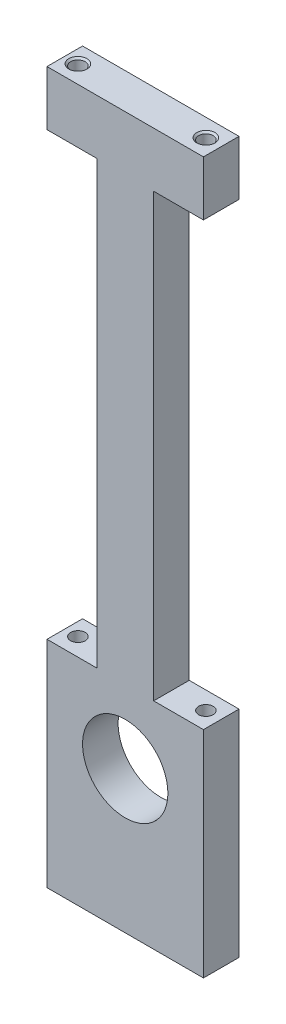
ISO-10303-21;
HEADER;
FILE_DESCRIPTION(('STEP AP214'),'2;1');
FILE_NAME('part.step','',(''),(''),'','','');
FILE_SCHEMA(('AUTOMOTIVE_DESIGN { 1 0 10303 214 1 1 1 1 }'));
ENDSEC;
DATA;
#1=APPLICATION_CONTEXT('core data for automotive mechanical design processes');
#2=APPLICATION_PROTOCOL_DEFINITION('international standard','automotive_design',2000,#1);
#3=PRODUCT_CONTEXT('',#1,'mechanical');
#4=PRODUCT('Part','Part','',(#3));
#5=PRODUCT_RELATED_PRODUCT_CATEGORY('part','',(#4));
#6=PRODUCT_DEFINITION_FORMATION('','',#4);
#7=PRODUCT_DEFINITION_CONTEXT('part definition',#1,'design');
#8=PRODUCT_DEFINITION('design','',#6,#7);
#9=PRODUCT_DEFINITION_SHAPE('','',#8);
#10=(LENGTH_UNIT() NAMED_UNIT(*) SI_UNIT(.MILLI.,.METRE.));
#11=(NAMED_UNIT(*) PLANE_ANGLE_UNIT() SI_UNIT($,.RADIAN.));
#12=(NAMED_UNIT(*) SI_UNIT($,.STERADIAN.) SOLID_ANGLE_UNIT());
#13=UNCERTAINTY_MEASURE_WITH_UNIT(LENGTH_MEASURE(1.E-05),#10,'distance_accuracy_value','');
#14=(GEOMETRIC_REPRESENTATION_CONTEXT(3) GLOBAL_UNCERTAINTY_ASSIGNED_CONTEXT((#13)) GLOBAL_UNIT_ASSIGNED_CONTEXT((#10,
#11,#12)) REPRESENTATION_CONTEXT('',''));
#15=CARTESIAN_POINT('',(0.,0.,0.));
#16=DIRECTION('',(0.,0.,1.));
#17=DIRECTION('',(1.,0.,0.));
#18=AXIS2_PLACEMENT_3D('',#15,#16,#17);
#19=CARTESIAN_POINT('',(-11.,10.2507068870375,5.));
#20=DIRECTION('',(0.,-1.,0.));
#21=DIRECTION('',(0.,0.,-1.));
#22=AXIS2_PLACEMENT_3D('',#19,#20,#21);
#23=PLANE('',#22);
#24=CARTESIAN_POINT('',(-9.15471218437872,10.2507068870375,2.5));
#25=DIRECTION('',(0.,-1.,0.));
#26=DIRECTION('',(0.,0.,-1.));
#27=AXIS2_PLACEMENT_3D('',#24,#25,#26);
#28=CIRCLE('',#27,1.02499999999998);
#29=CARTESIAN_POINT('',(-9.15471218437872,10.2507068870375,1.47500000000002));
#30=VERTEX_POINT('',#29);
#31=EDGE_CURVE('E167',#30,#30,#28,.T.);
#32=ORIENTED_EDGE('',*,*,#31,.T.);
#33=EDGE_LOOP('',(#32));
#34=FACE_BOUND('',#33,.T.);
#35=DIRECTION('',(0.,0.,1.));
#36=VECTOR('',#35,1.);
#37=CARTESIAN_POINT('',(-4.00000000000001,10.2507068870375,-73.136611144884));
#38=LINE('',#37,#36);
#39=CARTESIAN_POINT('',(-4.00000000000001,10.2507068870375,0.));
#40=VERTEX_POINT('',#39);
#41=CARTESIAN_POINT('',(-4.00000000000001,10.2507068870375,5.));
#42=VERTEX_POINT('',#41);
#43=EDGE_CURVE('E60',#40,#42,#38,.T.);
#44=ORIENTED_EDGE('',*,*,#43,.F.);
#45=DIRECTION('',(-1.,0.,0.));
#46=VECTOR('',#45,1.);
#47=CARTESIAN_POINT('',(-11.,10.2507068870375,0.));
#48=LINE('',#47,#46);
#49=CARTESIAN_POINT('',(-11.,10.2507068870375,0.));
#50=VERTEX_POINT('',#49);
#51=EDGE_CURVE('E248',#40,#50,#48,.T.);
#52=ORIENTED_EDGE('',*,*,#51,.T.);
#53=DIRECTION('',(0.,0.,-1.));
#54=VECTOR('',#53,1.);
#55=CARTESIAN_POINT('',(-11.,10.2507068870375,5.));
#56=LINE('',#55,#54);
#57=CARTESIAN_POINT('',(-11.,10.2507068870375,5.));
#58=VERTEX_POINT('',#57);
#59=EDGE_CURVE('E45',#58,#50,#56,.T.);
#60=ORIENTED_EDGE('',*,*,#59,.F.);
#61=DIRECTION('',(-1.,0.,0.));
#62=VECTOR('',#61,1.);
#63=CARTESIAN_POINT('',(-11.,10.2507068870375,5.));
#64=LINE('',#63,#62);
#65=EDGE_CURVE('E134',#42,#58,#64,.T.);
#66=ORIENTED_EDGE('',*,*,#65,.F.);
#67=EDGE_LOOP('',(#44,#52,#60,#66));
#68=FACE_BOUND('',#67,.T.);
#69=ADVANCED_FACE('F37',(#34,#68),#23,.F.);
#70=CARTESIAN_POINT('',(0.,0.,5.));
#71=DIRECTION('',(0.,0.,-1.));
#72=DIRECTION('',(-1.,0.,0.));
#73=AXIS2_PLACEMENT_3D('',#70,#71,#72);
#74=CYLINDRICAL_SURFACE('',#73,6.);
#75=CARTESIAN_POINT('',(0.,0.,0.));
#76=DIRECTION('',(0.,0.,-1.));
#77=DIRECTION('',(1.,0.,0.));
#78=AXIS2_PLACEMENT_3D('',#75,#76,#77);
#79=CIRCLE('',#78,6.);
#80=CARTESIAN_POINT('',(6.,0.,0.));
#81=VERTEX_POINT('',#80);
#82=EDGE_CURVE('E205',#81,#81,#79,.T.);
#83=ORIENTED_EDGE('',*,*,#82,.T.);
#84=EDGE_LOOP('',(#83));
#85=FACE_BOUND('',#84,.T.);
#86=CARTESIAN_POINT('',(0.,0.,5.));
#87=DIRECTION('',(0.,0.,-1.));
#88=DIRECTION('',(1.,0.,0.));
#89=AXIS2_PLACEMENT_3D('',#86,#87,#88);
#90=CIRCLE('',#89,6.);
#91=CARTESIAN_POINT('',(6.,0.,5.));
#92=VERTEX_POINT('',#91);
#93=EDGE_CURVE('E238',#92,#92,#90,.T.);
#94=ORIENTED_EDGE('',*,*,#93,.F.);
#95=EDGE_LOOP('',(#94));
#96=FACE_BOUND('',#95,.T.);
#97=ADVANCED_FACE('F39',(#85,#96),#74,.F.);
#98=CARTESIAN_POINT('',(11.,10.2507068870375,5.));
#99=DIRECTION('',(-1.,0.,0.));
#100=DIRECTION('',(0.,0.,1.));
#101=AXIS2_PLACEMENT_3D('',#98,#99,#100);
#102=PLANE('',#101);
#103=DIRECTION('',(0.,1.,0.));
#104=VECTOR('',#103,1.);
#105=CARTESIAN_POINT('',(11.,10.2507068870375,0.));
#106=LINE('',#105,#104);
#107=CARTESIAN_POINT('',(11.,-20.,0.));
#108=VERTEX_POINT('',#107);
#109=CARTESIAN_POINT('',(11.,10.2507068870375,0.));
#110=VERTEX_POINT('',#109);
#111=EDGE_CURVE('E246',#108,#110,#106,.T.);
#112=ORIENTED_EDGE('',*,*,#111,.T.);
#113=DIRECTION('',(0.,0.,-1.));
#114=VECTOR('',#113,1.);
#115=CARTESIAN_POINT('',(11.,10.2507068870375,5.));
#116=LINE('',#115,#114);
#117=CARTESIAN_POINT('',(11.,10.2507068870375,5.));
#118=VERTEX_POINT('',#117);
#119=EDGE_CURVE('E11',#118,#110,#116,.T.);
#120=ORIENTED_EDGE('',*,*,#119,.F.);
#121=DIRECTION('',(0.,1.,0.));
#122=VECTOR('',#121,1.);
#123=CARTESIAN_POINT('',(11.,10.2507068870375,5.));
#124=LINE('',#123,#122);
#125=CARTESIAN_POINT('',(11.,-20.,5.));
#126=VERTEX_POINT('',#125);
#127=EDGE_CURVE('E241',#126,#118,#124,.T.);
#128=ORIENTED_EDGE('',*,*,#127,.F.);
#129=DIRECTION('',(0.,0.,1.));
#130=VECTOR('',#129,1.);
#131=CARTESIAN_POINT('',(11.,-20.,-24.1660919471891));
#132=LINE('',#131,#130);
#133=EDGE_CURVE('E148',#108,#126,#132,.T.);
#134=ORIENTED_EDGE('',*,*,#133,.F.);
#135=EDGE_LOOP('',(#112,#120,#128,#134));
#136=FACE_BOUND('',#135,.T.);
#137=ADVANCED_FACE('F258',(#136),#102,.F.);
#138=CARTESIAN_POINT('',(8.84528781562128,10.2507068870375,2.5));
#139=DIRECTION('',(0.,-1.,0.));
#140=DIRECTION('',(0.,0.,-1.));
#141=AXIS2_PLACEMENT_3D('',#138,#139,#140);
#142=CIRCLE('',#141,1.02499999999998);
#143=CARTESIAN_POINT('',(8.84528781562128,10.2507068870375,1.47500000000002));
#144=VERTEX_POINT('',#143);
#145=EDGE_CURVE('E185',#144,#144,#142,.T.);
#146=ORIENTED_EDGE('',*,*,#145,.T.);
#147=EDGE_LOOP('',(#146));
#148=FACE_BOUND('',#147,.T.);
#149=CARTESIAN_POINT('',(4.00000000000001,10.2507068870375,0.));
#150=VERTEX_POINT('',#149);
#151=EDGE_CURVE('E249',#110,#150,#48,.T.);
#152=ORIENTED_EDGE('',*,*,#151,.T.);
#153=DIRECTION('',(0.,0.,1.));
#154=VECTOR('',#153,1.);
#155=CARTESIAN_POINT('',(4.00000000000001,10.2507068870375,-73.136611144884));
#156=LINE('',#155,#154);
#157=CARTESIAN_POINT('',(4.00000000000001,10.2507068870375,5.));
#158=VERTEX_POINT('',#157);
#159=EDGE_CURVE('E52',#150,#158,#156,.T.);
#160=ORIENTED_EDGE('',*,*,#159,.T.);
#161=EDGE_CURVE('E138',#118,#158,#64,.T.);
#162=ORIENTED_EDGE('',*,*,#161,.F.);
#163=ORIENTED_EDGE('',*,*,#119,.T.);
#164=EDGE_LOOP('',(#152,#160,#162,#163));
#165=FACE_BOUND('',#164,.T.);
#166=ADVANCED_FACE('F307',(#148,#165),#23,.F.);
#167=CARTESIAN_POINT('',(-11.,0.,5.));
#168=DIRECTION('',(1.,0.,0.));
#169=DIRECTION('',(0.,0.,-1.));
#170=AXIS2_PLACEMENT_3D('',#167,#168,#169);
#171=PLANE('',#170);
#172=DIRECTION('',(0.,-1.,0.));
#173=VECTOR('',#172,1.);
#174=CARTESIAN_POINT('',(-11.,0.,0.));
#175=LINE('',#174,#173);
#176=CARTESIAN_POINT('',(-11.,-20.,0.));
#177=VERTEX_POINT('',#176);
#178=EDGE_CURVE('E144',#50,#177,#175,.T.);
#179=ORIENTED_EDGE('',*,*,#178,.T.);
#180=DIRECTION('',(0.,0.,1.));
#181=VECTOR('',#180,1.);
#182=CARTESIAN_POINT('',(-11.,-20.,-24.1660919471891));
#183=LINE('',#182,#181);
#184=CARTESIAN_POINT('',(-11.,-20.,5.));
#185=VERTEX_POINT('',#184);
#186=EDGE_CURVE('E141',#177,#185,#183,.T.);
#187=ORIENTED_EDGE('',*,*,#186,.T.);
#188=DIRECTION('',(0.,-1.,0.));
#189=VECTOR('',#188,1.);
#190=CARTESIAN_POINT('',(-11.,0.,5.));
#191=LINE('',#190,#189);
#192=EDGE_CURVE('E127',#58,#185,#191,.T.);
#193=ORIENTED_EDGE('',*,*,#192,.F.);
#194=ORIENTED_EDGE('',*,*,#59,.T.);
#195=EDGE_LOOP('',(#179,#187,#193,#194));
#196=FACE_BOUND('',#195,.T.);
#197=ADVANCED_FACE('F142',(#196),#171,.F.);
#198=CARTESIAN_POINT('',(0.,0.,5.));
#199=DIRECTION('',(0.,0.,1.));
#200=DIRECTION('',(1.,0.,0.));
#201=AXIS2_PLACEMENT_3D('',#198,#199,#200);
#202=PLANE('',#201);
#203=ORIENTED_EDGE('',*,*,#192,.T.);
#204=DIRECTION('',(1.,0.,0.));
#205=VECTOR('',#204,1.);
#206=CARTESIAN_POINT('',(-11.,-20.,5.));
#207=LINE('',#206,#205);
#208=EDGE_CURVE('E132',#185,#126,#207,.T.);
#209=ORIENTED_EDGE('',*,*,#208,.T.);
#210=ORIENTED_EDGE('',*,*,#127,.T.);
#211=ORIENTED_EDGE('',*,*,#161,.T.);
#212=DIRECTION('',(0.,1.,0.));
#213=VECTOR('',#212,1.);
#214=CARTESIAN_POINT('',(4.,72.3111198121981,5.));
#215=LINE('',#214,#213);
#216=CARTESIAN_POINT('',(4.,72.3111198121981,5.));
#217=VERTEX_POINT('',#216);
#218=EDGE_CURVE('E207',#158,#217,#215,.T.);
#219=ORIENTED_EDGE('',*,*,#218,.T.);
#220=DIRECTION('',(1.,0.,0.));
#221=VECTOR('',#220,1.);
#222=CARTESIAN_POINT('',(11.,72.3111198121981,5.));
#223=LINE('',#222,#221);
#224=CARTESIAN_POINT('',(11.,72.3111198121981,5.));
#225=VERTEX_POINT('',#224);
#226=EDGE_CURVE('E210',#217,#225,#223,.T.);
#227=ORIENTED_EDGE('',*,*,#226,.T.);
#228=DIRECTION('',(0.,1.,0.));
#229=VECTOR('',#228,1.);
#230=CARTESIAN_POINT('',(11.,80.,5.));
#231=LINE('',#230,#229);
#232=CARTESIAN_POINT('',(11.,80.,5.));
#233=VERTEX_POINT('',#232);
#234=EDGE_CURVE('E213',#225,#233,#231,.T.);
#235=ORIENTED_EDGE('',*,*,#234,.T.);
#236=DIRECTION('',(-1.,0.,0.));
#237=VECTOR('',#236,1.);
#238=CARTESIAN_POINT('',(-11.,80.,5.));
#239=LINE('',#238,#237);
#240=CARTESIAN_POINT('',(-11.,80.,5.));
#241=VERTEX_POINT('',#240);
#242=EDGE_CURVE('E216',#233,#241,#239,.T.);
#243=ORIENTED_EDGE('',*,*,#242,.T.);
#244=DIRECTION('',(0.,-1.,0.));
#245=VECTOR('',#244,1.);
#246=CARTESIAN_POINT('',(-11.,72.3111198121981,5.));
#247=LINE('',#246,#245);
#248=CARTESIAN_POINT('',(-11.,72.3111198121981,5.));
#249=VERTEX_POINT('',#248);
#250=EDGE_CURVE('E219',#241,#249,#247,.T.);
#251=ORIENTED_EDGE('',*,*,#250,.T.);
#252=DIRECTION('',(1.,0.,0.));
#253=VECTOR('',#252,1.);
#254=CARTESIAN_POINT('',(-4.,72.3111198121981,5.));
#255=LINE('',#254,#253);
#256=CARTESIAN_POINT('',(-4.,72.3111198121981,5.));
#257=VERTEX_POINT('',#256);
#258=EDGE_CURVE('E222',#249,#257,#255,.T.);
#259=ORIENTED_EDGE('',*,*,#258,.T.);
#260=DIRECTION('',(0.,-1.,0.));
#261=VECTOR('',#260,1.);
#262=CARTESIAN_POINT('',(-4.,72.3111198121981,5.));
#263=LINE('',#262,#261);
#264=EDGE_CURVE('E188',#257,#42,#263,.T.);
#265=ORIENTED_EDGE('',*,*,#264,.T.);
#266=ORIENTED_EDGE('',*,*,#65,.T.);
#267=EDGE_LOOP('',(#203,#209,#210,#211,#219,#227,#235,#243,#251,#259,#265,#266));
#268=FACE_BOUND('',#267,.T.);
#269=ORIENTED_EDGE('',*,*,#93,.T.);
#270=EDGE_LOOP('',(#269));
#271=FACE_BOUND('',#270,.T.);
#272=ADVANCED_FACE('F129',(#268,#271),#202,.T.);
#273=CARTESIAN_POINT('',(0.,0.,0.));
#274=DIRECTION('',(0.,0.,1.));
#275=DIRECTION('',(1.,0.,0.));
#276=AXIS2_PLACEMENT_3D('',#273,#274,#275);
#277=PLANE('',#276);
#278=ORIENTED_EDGE('',*,*,#111,.F.);
#279=DIRECTION('',(-1.,0.,0.));
#280=VECTOR('',#279,1.);
#281=CARTESIAN_POINT('',(-11.,-20.,0.));
#282=LINE('',#281,#280);
#283=EDGE_CURVE('E155',#108,#177,#282,.T.);
#284=ORIENTED_EDGE('',*,*,#283,.T.);
#285=ORIENTED_EDGE('',*,*,#178,.F.);
#286=ORIENTED_EDGE('',*,*,#51,.F.);
#287=DIRECTION('',(0.,1.,0.));
#288=VECTOR('',#287,1.);
#289=CARTESIAN_POINT('',(-4.,72.3111198121981,0.));
#290=LINE('',#289,#288);
#291=CARTESIAN_POINT('',(-4.,72.3111198121981,0.));
#292=VERTEX_POINT('',#291);
#293=EDGE_CURVE('E203',#40,#292,#290,.T.);
#294=ORIENTED_EDGE('',*,*,#293,.T.);
#295=DIRECTION('',(-1.,0.,0.));
#296=VECTOR('',#295,1.);
#297=CARTESIAN_POINT('',(-4.,72.3111198121981,0.));
#298=LINE('',#297,#296);
#299=CARTESIAN_POINT('',(-11.,72.3111198121981,0.));
#300=VERTEX_POINT('',#299);
#301=EDGE_CURVE('E201',#292,#300,#298,.T.);
#302=ORIENTED_EDGE('',*,*,#301,.T.);
#303=DIRECTION('',(0.,1.,0.));
#304=VECTOR('',#303,1.);
#305=CARTESIAN_POINT('',(-11.,72.3111198121981,0.));
#306=LINE('',#305,#304);
#307=CARTESIAN_POINT('',(-11.,80.,0.));
#308=VERTEX_POINT('',#307);
#309=EDGE_CURVE('E199',#300,#308,#306,.T.);
#310=ORIENTED_EDGE('',*,*,#309,.T.);
#311=DIRECTION('',(1.,0.,0.));
#312=VECTOR('',#311,1.);
#313=CARTESIAN_POINT('',(-11.,80.,0.));
#314=LINE('',#313,#312);
#315=CARTESIAN_POINT('',(11.,80.,0.));
#316=VERTEX_POINT('',#315);
#317=EDGE_CURVE('E197',#308,#316,#314,.T.);
#318=ORIENTED_EDGE('',*,*,#317,.T.);
#319=DIRECTION('',(0.,-1.,0.));
#320=VECTOR('',#319,1.);
#321=CARTESIAN_POINT('',(11.,80.,0.));
#322=LINE('',#321,#320);
#323=CARTESIAN_POINT('',(11.,72.3111198121981,0.));
#324=VERTEX_POINT('',#323);
#325=EDGE_CURVE('E195',#316,#324,#322,.T.);
#326=ORIENTED_EDGE('',*,*,#325,.T.);
#327=DIRECTION('',(-1.,0.,0.));
#328=VECTOR('',#327,1.);
#329=CARTESIAN_POINT('',(11.,72.3111198121981,0.));
#330=LINE('',#329,#328);
#331=CARTESIAN_POINT('',(4.,72.3111198121981,0.));
#332=VERTEX_POINT('',#331);
#333=EDGE_CURVE('E192',#324,#332,#330,.T.);
#334=ORIENTED_EDGE('',*,*,#333,.T.);
#335=DIRECTION('',(0.,-1.,0.));
#336=VECTOR('',#335,1.);
#337=CARTESIAN_POINT('',(4.,72.3111198121981,0.));
#338=LINE('',#337,#336);
#339=EDGE_CURVE('E189',#332,#150,#338,.T.);
#340=ORIENTED_EDGE('',*,*,#339,.T.);
#341=ORIENTED_EDGE('',*,*,#151,.F.);
#342=EDGE_LOOP('',(#278,#284,#285,#286,#294,#302,#310,#318,#326,#334,#340,#341));
#343=FACE_BOUND('',#342,.T.);
#344=ORIENTED_EDGE('',*,*,#82,.F.);
#345=EDGE_LOOP('',(#344));
#346=FACE_BOUND('',#345,.T.);
#347=ADVANCED_FACE('F252',(#343,#346),#277,.F.);
#348=CARTESIAN_POINT('',(-4.,72.3111198121981,-73.136611144884));
#349=DIRECTION('',(-1.,0.,0.));
#350=DIRECTION('',(0.,-1.,0.));
#351=AXIS2_PLACEMENT_3D('',#348,#349,#350);
#352=PLANE('',#351);
#353=ORIENTED_EDGE('',*,*,#293,.F.);
#354=ORIENTED_EDGE('',*,*,#43,.T.);
#355=ORIENTED_EDGE('',*,*,#264,.F.);
#356=DIRECTION('',(0.,0.,1.));
#357=VECTOR('',#356,1.);
#358=CARTESIAN_POINT('',(-4.,72.3111198121981,-73.136611144884));
#359=LINE('',#358,#357);
#360=EDGE_CURVE('E193',#292,#257,#359,.T.);
#361=ORIENTED_EDGE('',*,*,#360,.F.);
#362=EDGE_LOOP('',(#353,#354,#355,#361));
#363=FACE_BOUND('',#362,.T.);
#364=ADVANCED_FACE('F291',(#363),#352,.T.);
#365=CARTESIAN_POINT('',(-4.,72.3111198121981,-73.136611144884));
#366=DIRECTION('',(0.,-1.,0.));
#367=DIRECTION('',(0.,0.,-1.));
#368=AXIS2_PLACEMENT_3D('',#365,#366,#367);
#369=PLANE('',#368);
#370=CARTESIAN_POINT('',(-9.15471218437872,72.3111198121981,2.5));
#371=DIRECTION('',(0.,-1.,0.));
#372=DIRECTION('',(0.,0.,-1.));
#373=AXIS2_PLACEMENT_3D('',#370,#371,#372);
#374=CIRCLE('',#373,1.02499999999998);
#375=CARTESIAN_POINT('',(-9.15471218437872,72.3111198121981,1.47500000000002));
#376=VERTEX_POINT('',#375);
#377=EDGE_CURVE('E170',#376,#376,#374,.T.);
#378=ORIENTED_EDGE('',*,*,#377,.F.);
#379=EDGE_LOOP('',(#378));
#380=FACE_BOUND('',#379,.T.);
#381=ORIENTED_EDGE('',*,*,#301,.F.);
#382=ORIENTED_EDGE('',*,*,#360,.T.);
#383=ORIENTED_EDGE('',*,*,#258,.F.);
#384=DIRECTION('',(0.,0.,1.));
#385=VECTOR('',#384,1.);
#386=CARTESIAN_POINT('',(-11.,72.3111198121981,-73.136611144884));
#387=LINE('',#386,#385);
#388=EDGE_CURVE('E226',#300,#249,#387,.T.);
#389=ORIENTED_EDGE('',*,*,#388,.F.);
#390=EDGE_LOOP('',(#381,#382,#383,#389));
#391=FACE_BOUND('',#390,.T.);
#392=ADVANCED_FACE('F287',(#380,#391),#369,.T.);
#393=CARTESIAN_POINT('',(-11.,72.3111198121981,-73.136611144884));
#394=DIRECTION('',(-1.,0.,0.));
#395=DIRECTION('',(0.,0.,1.));
#396=AXIS2_PLACEMENT_3D('',#393,#394,#395);
#397=PLANE('',#396);
#398=ORIENTED_EDGE('',*,*,#309,.F.);
#399=ORIENTED_EDGE('',*,*,#388,.T.);
#400=ORIENTED_EDGE('',*,*,#250,.F.);
#401=DIRECTION('',(0.,0.,1.));
#402=VECTOR('',#401,1.);
#403=CARTESIAN_POINT('',(-11.,80.,-73.136611144884));
#404=LINE('',#403,#402);
#405=EDGE_CURVE('E228',#308,#241,#404,.T.);
#406=ORIENTED_EDGE('',*,*,#405,.F.);
#407=EDGE_LOOP('',(#398,#399,#400,#406));
#408=FACE_BOUND('',#407,.T.);
#409=ADVANCED_FACE('F282',(#408),#397,.T.);
#410=CARTESIAN_POINT('',(-11.,80.,-73.136611144884));
#411=DIRECTION('',(0.,1.,0.));
#412=DIRECTION('',(0.,0.,1.));
#413=AXIS2_PLACEMENT_3D('',#410,#411,#412);
#414=PLANE('',#413);
#415=CARTESIAN_POINT('',(-9.15471218437872,80.,2.5));
#416=DIRECTION('',(0.,1.,0.));
#417=DIRECTION('',(0.,0.,1.));
#418=AXIS2_PLACEMENT_3D('',#415,#416,#417);
#419=CIRCLE('',#418,1.275);
#420=CARTESIAN_POINT('',(-9.15471218437872,80.,3.775));
#421=VERTEX_POINT('',#420);
#422=EDGE_CURVE('E158',#421,#421,#419,.T.);
#423=ORIENTED_EDGE('',*,*,#422,.F.);
#424=EDGE_LOOP('',(#423));
#425=FACE_BOUND('',#424,.T.);
#426=CARTESIAN_POINT('',(8.84528781562128,80.,2.5));
#427=DIRECTION('',(0.,1.,0.));
#428=DIRECTION('',(0.,0.,1.));
#429=AXIS2_PLACEMENT_3D('',#426,#427,#428);
#430=CIRCLE('',#429,1.275);
#431=CARTESIAN_POINT('',(8.84528781562128,80.,3.775));
#432=VERTEX_POINT('',#431);
#433=EDGE_CURVE('E173',#432,#432,#430,.T.);
#434=ORIENTED_EDGE('',*,*,#433,.F.);
#435=EDGE_LOOP('',(#434));
#436=FACE_BOUND('',#435,.T.);
#437=ORIENTED_EDGE('',*,*,#317,.F.);
#438=ORIENTED_EDGE('',*,*,#405,.T.);
#439=ORIENTED_EDGE('',*,*,#242,.F.);
#440=DIRECTION('',(0.,0.,1.));
#441=VECTOR('',#440,1.);
#442=CARTESIAN_POINT('',(11.,80.,-73.136611144884));
#443=LINE('',#442,#441);
#444=EDGE_CURVE('E230',#316,#233,#443,.T.);
#445=ORIENTED_EDGE('',*,*,#444,.F.);
#446=EDGE_LOOP('',(#437,#438,#439,#445));
#447=FACE_BOUND('',#446,.T.);
#448=ADVANCED_FACE('F277',(#425,#436,#447),#414,.T.);
#449=CARTESIAN_POINT('',(11.,80.,-73.136611144884));
#450=DIRECTION('',(1.,0.,0.));
#451=DIRECTION('',(0.,1.,0.));
#452=AXIS2_PLACEMENT_3D('',#449,#450,#451);
#453=PLANE('',#452);
#454=ORIENTED_EDGE('',*,*,#325,.F.);
#455=ORIENTED_EDGE('',*,*,#444,.T.);
#456=ORIENTED_EDGE('',*,*,#234,.F.);
#457=DIRECTION('',(0.,0.,1.));
#458=VECTOR('',#457,1.);
#459=CARTESIAN_POINT('',(11.,72.3111198121981,-73.136611144884));
#460=LINE('',#459,#458);
#461=EDGE_CURVE('E232',#324,#225,#460,.T.);
#462=ORIENTED_EDGE('',*,*,#461,.F.);
#463=EDGE_LOOP('',(#454,#455,#456,#462));
#464=FACE_BOUND('',#463,.T.);
#465=ADVANCED_FACE('F273',(#464),#453,.T.);
#466=CARTESIAN_POINT('',(11.,72.3111198121981,-73.136611144884));
#467=DIRECTION('',(0.,-1.,0.));
#468=DIRECTION('',(0.,0.,-1.));
#469=AXIS2_PLACEMENT_3D('',#466,#467,#468);
#470=PLANE('',#469);
#471=CARTESIAN_POINT('',(8.84528781562128,72.3111198121981,2.5));
#472=DIRECTION('',(0.,-1.,0.));
#473=DIRECTION('',(0.,0.,-1.));
#474=AXIS2_PLACEMENT_3D('',#471,#472,#473);
#475=CIRCLE('',#474,1.02499999999998);
#476=CARTESIAN_POINT('',(8.84528781562128,72.3111198121981,1.47500000000002));
#477=VERTEX_POINT('',#476);
#478=EDGE_CURVE('E182',#477,#477,#475,.T.);
#479=ORIENTED_EDGE('',*,*,#478,.F.);
#480=EDGE_LOOP('',(#479));
#481=FACE_BOUND('',#480,.T.);
#482=ORIENTED_EDGE('',*,*,#333,.F.);
#483=ORIENTED_EDGE('',*,*,#461,.T.);
#484=ORIENTED_EDGE('',*,*,#226,.F.);
#485=DIRECTION('',(0.,0.,1.));
#486=VECTOR('',#485,1.);
#487=CARTESIAN_POINT('',(4.,72.3111198121981,-73.136611144884));
#488=LINE('',#487,#486);
#489=EDGE_CURVE('E234',#332,#217,#488,.T.);
#490=ORIENTED_EDGE('',*,*,#489,.F.);
#491=EDGE_LOOP('',(#482,#483,#484,#490));
#492=FACE_BOUND('',#491,.T.);
#493=ADVANCED_FACE('F267',(#481,#492),#470,.T.);
#494=CARTESIAN_POINT('',(4.,72.3111198121981,-73.136611144884));
#495=DIRECTION('',(1.,0.,0.));
#496=DIRECTION('',(0.,1.,0.));
#497=AXIS2_PLACEMENT_3D('',#494,#495,#496);
#498=PLANE('',#497);
#499=ORIENTED_EDGE('',*,*,#339,.F.);
#500=ORIENTED_EDGE('',*,*,#489,.T.);
#501=ORIENTED_EDGE('',*,*,#218,.F.);
#502=ORIENTED_EDGE('',*,*,#159,.F.);
#503=EDGE_LOOP('',(#499,#500,#501,#502));
#504=FACE_BOUND('',#503,.T.);
#505=ADVANCED_FACE('F262',(#504),#498,.T.);
#506=CARTESIAN_POINT('',(8.84528781562128,80.,2.5));
#507=DIRECTION('',(0.,1.,0.));
#508=DIRECTION('',(0.,0.,1.));
#509=AXIS2_PLACEMENT_3D('',#506,#507,#508);
#510=CYLINDRICAL_SURFACE('',#509,1.02499999999998);
#511=CARTESIAN_POINT('',(8.84528781562128,-9.99999999999999,2.5));
#512=DIRECTION('',(0.,1.,0.));
#513=DIRECTION('',(0.,0.,1.));
#514=AXIS2_PLACEMENT_3D('',#511,#512,#513);
#515=CIRCLE('',#514,1.02499999999998);
#516=CARTESIAN_POINT('',(8.84528781562128,-9.99999999999999,3.52499999999998));
#517=VERTEX_POINT('',#516);
#518=EDGE_CURVE('E179',#517,#517,#515,.T.);
#519=ORIENTED_EDGE('',*,*,#518,.F.);
#520=EDGE_LOOP('',(#519));
#521=FACE_BOUND('',#520,.T.);
#522=ORIENTED_EDGE('',*,*,#145,.F.);
#523=EDGE_LOOP('',(#522));
#524=FACE_BOUND('',#523,.T.);
#525=ADVANCED_FACE('F320',(#521,#524),#510,.F.);
#526=ORIENTED_EDGE('',*,*,#478,.T.);
#527=EDGE_LOOP('',(#526));
#528=FACE_BOUND('',#527,.T.);
#529=CARTESIAN_POINT('',(8.84528781562128,79.75,2.5));
#530=DIRECTION('',(0.,1.,0.));
#531=DIRECTION('',(0.,0.,1.));
#532=AXIS2_PLACEMENT_3D('',#529,#530,#531);
#533=CIRCLE('',#532,1.02499999999999);
#534=CARTESIAN_POINT('',(8.84528781562128,79.75,3.52499999999999));
#535=VERTEX_POINT('',#534);
#536=EDGE_CURVE('E176',#535,#535,#533,.T.);
#537=ORIENTED_EDGE('',*,*,#536,.T.);
#538=EDGE_LOOP('',(#537));
#539=FACE_BOUND('',#538,.T.);
#540=ADVANCED_FACE('F322',(#528,#539),#510,.F.);
#541=CARTESIAN_POINT('',(8.84528781562128,80.,2.5));
#542=DIRECTION('',(0.,1.,0.));
#543=DIRECTION('',(0.,0.,1.));
#544=AXIS2_PLACEMENT_3D('',#541,#542,#543);
#545=CONICAL_SURFACE('',#544,1.275,0.785398163397445);
#546=ORIENTED_EDGE('',*,*,#536,.F.);
#547=EDGE_LOOP('',(#546));
#548=FACE_BOUND('',#547,.T.);
#549=ORIENTED_EDGE('',*,*,#433,.T.);
#550=EDGE_LOOP('',(#549));
#551=FACE_BOUND('',#550,.T.);
#552=ADVANCED_FACE('F329',(#548,#551),#545,.F.);
#553=CARTESIAN_POINT('',(-9.15471218437872,80.,2.5));
#554=DIRECTION('',(0.,1.,0.));
#555=DIRECTION('',(0.,0.,1.));
#556=AXIS2_PLACEMENT_3D('',#553,#554,#555);
#557=CYLINDRICAL_SURFACE('',#556,1.02499999999998);
#558=CARTESIAN_POINT('',(-9.15471218437872,-9.99999999999999,2.5));
#559=DIRECTION('',(0.,1.,0.));
#560=DIRECTION('',(0.,0.,1.));
#561=AXIS2_PLACEMENT_3D('',#558,#559,#560);
#562=CIRCLE('',#561,1.02499999999998);
#563=CARTESIAN_POINT('',(-9.15471218437872,-9.99999999999999,3.52499999999998));
#564=VERTEX_POINT('',#563);
#565=EDGE_CURVE('E164',#564,#564,#562,.T.);
#566=ORIENTED_EDGE('',*,*,#565,.F.);
#567=EDGE_LOOP('',(#566));
#568=FACE_BOUND('',#567,.T.);
#569=ORIENTED_EDGE('',*,*,#31,.F.);
#570=EDGE_LOOP('',(#569));
#571=FACE_BOUND('',#570,.T.);
#572=ADVANCED_FACE('F352',(#568,#571),#557,.F.);
#573=ORIENTED_EDGE('',*,*,#377,.T.);
#574=EDGE_LOOP('',(#573));
#575=FACE_BOUND('',#574,.T.);
#576=CARTESIAN_POINT('',(-9.15471218437872,79.75,2.5));
#577=DIRECTION('',(0.,1.,0.));
#578=DIRECTION('',(0.,0.,1.));
#579=AXIS2_PLACEMENT_3D('',#576,#577,#578);
#580=CIRCLE('',#579,1.02499999999999);
#581=CARTESIAN_POINT('',(-9.15471218437872,79.75,3.52499999999999));
#582=VERTEX_POINT('',#581);
#583=EDGE_CURVE('E161',#582,#582,#580,.T.);
#584=ORIENTED_EDGE('',*,*,#583,.T.);
#585=EDGE_LOOP('',(#584));
#586=FACE_BOUND('',#585,.T.);
#587=ADVANCED_FACE('F358',(#575,#586),#557,.F.);
#588=CARTESIAN_POINT('',(-9.15471218437872,80.,2.5));
#589=DIRECTION('',(0.,1.,0.));
#590=DIRECTION('',(0.,0.,1.));
#591=AXIS2_PLACEMENT_3D('',#588,#589,#590);
#592=CONICAL_SURFACE('',#591,1.275,0.785398163397445);
#593=ORIENTED_EDGE('',*,*,#583,.F.);
#594=EDGE_LOOP('',(#593));
#595=FACE_BOUND('',#594,.T.);
#596=ORIENTED_EDGE('',*,*,#422,.T.);
#597=EDGE_LOOP('',(#596));
#598=FACE_BOUND('',#597,.T.);
#599=ADVANCED_FACE('F363',(#595,#598),#592,.F.);
#600=CARTESIAN_POINT('',(-11.,-9.99999999999999,-24.1660919471891));
#601=DIRECTION('',(0.,1.,0.));
#602=DIRECTION('',(0.,0.,1.));
#603=AXIS2_PLACEMENT_3D('',#600,#601,#602);
#604=PLANE('',#603);
#605=ORIENTED_EDGE('',*,*,#565,.T.);
#606=EDGE_LOOP('',(#605));
#607=FACE_BOUND('',#606,.T.);
#608=ADVANCED_FACE('F370',(#607),#604,.T.);
#609=ORIENTED_EDGE('',*,*,#518,.T.);
#610=EDGE_LOOP('',(#609));
#611=FACE_BOUND('',#610,.T.);
#612=ADVANCED_FACE('F374',(#611),#604,.T.);
#613=CARTESIAN_POINT('',(-11.,-20.,-24.1660919471891));
#614=DIRECTION('',(0.,-1.,0.));
#615=DIRECTION('',(0.,0.,-1.));
#616=AXIS2_PLACEMENT_3D('',#613,#614,#615);
#617=PLANE('',#616);
#618=ORIENTED_EDGE('',*,*,#283,.F.);
#619=ORIENTED_EDGE('',*,*,#133,.T.);
#620=ORIENTED_EDGE('',*,*,#208,.F.);
#621=ORIENTED_EDGE('',*,*,#186,.F.);
#622=EDGE_LOOP('',(#618,#619,#620,#621));
#623=FACE_BOUND('',#622,.T.);
#624=ADVANCED_FACE('F151',(#623),#617,.T.);
#625=CLOSED_SHELL('',(#69,#97,#137,#166,#197,#272,#347,#364,#392,#409,#448,#465,#493,#505,#525,
#540,#552,#572,#587,#599,#608,#612,#624));
#626=MANIFOLD_SOLID_BREP('B2',#625);
#627=ADVANCED_BREP_SHAPE_REPRESENTATION('',(#18,#626),#14);
#628=SHAPE_DEFINITION_REPRESENTATION(#9,#627);
ENDSEC;
END-ISO-10303-21;
